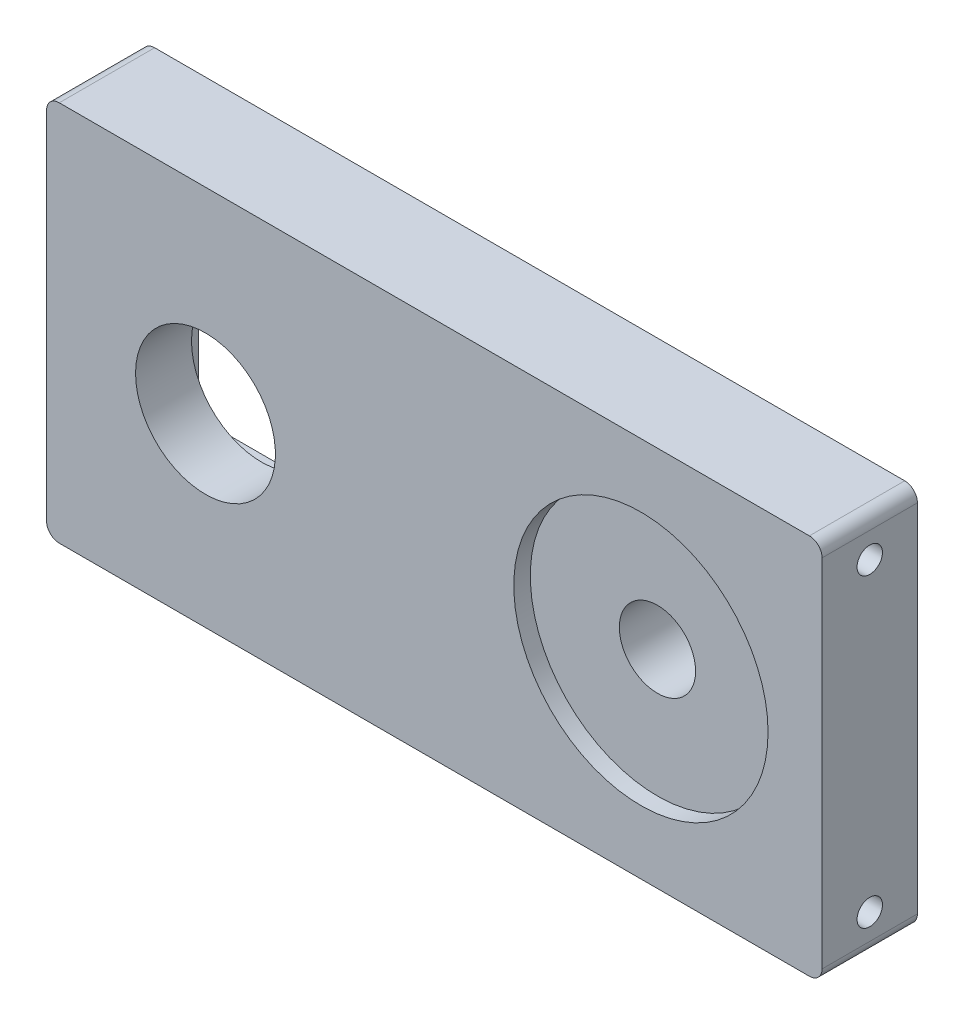
ISO-10303-21;
HEADER;
FILE_DESCRIPTION(('STEP AP214'),'2;1');
FILE_NAME('part.step','',(''),(''),'','','');
FILE_SCHEMA(('AUTOMOTIVE_DESIGN { 1 0 10303 214 1 1 1 1 }'));
ENDSEC;
DATA;
#1=APPLICATION_CONTEXT('core data for automotive mechanical design processes');
#2=APPLICATION_PROTOCOL_DEFINITION('international standard','automotive_design',2000,#1);
#3=PRODUCT_CONTEXT('',#1,'mechanical');
#4=PRODUCT('Part','Part','',(#3));
#5=PRODUCT_RELATED_PRODUCT_CATEGORY('part','',(#4));
#6=PRODUCT_DEFINITION_FORMATION('','',#4);
#7=PRODUCT_DEFINITION_CONTEXT('part definition',#1,'design');
#8=PRODUCT_DEFINITION('design','',#6,#7);
#9=PRODUCT_DEFINITION_SHAPE('','',#8);
#10=(LENGTH_UNIT() NAMED_UNIT(*) SI_UNIT(.MILLI.,.METRE.));
#11=(NAMED_UNIT(*) PLANE_ANGLE_UNIT() SI_UNIT($,.RADIAN.));
#12=(NAMED_UNIT(*) SI_UNIT($,.STERADIAN.) SOLID_ANGLE_UNIT());
#13=UNCERTAINTY_MEASURE_WITH_UNIT(LENGTH_MEASURE(1.E-05),#10,'distance_accuracy_value','');
#14=(GEOMETRIC_REPRESENTATION_CONTEXT(3) GLOBAL_UNCERTAINTY_ASSIGNED_CONTEXT((#13)) GLOBAL_UNIT_ASSIGNED_CONTEXT((#10,
#11,#12)) REPRESENTATION_CONTEXT('',''));
#15=CARTESIAN_POINT('',(0.,0.,0.));
#16=DIRECTION('',(0.,0.,1.));
#17=DIRECTION('',(1.,0.,0.));
#18=AXIS2_PLACEMENT_3D('',#15,#16,#17);
#19=CARTESIAN_POINT('',(32.5,0.,-12.45));
#20=DIRECTION('',(0.,0.,1.));
#21=DIRECTION('',(1.,0.,0.));
#22=AXIS2_PLACEMENT_3D('',#19,#20,#21);
#23=CYLINDRICAL_SURFACE('',#22,6.);
#24=CARTESIAN_POINT('',(32.5,0.,-7.5));
#25=DIRECTION('',(0.,0.,-1.));
#26=DIRECTION('',(-1.,0.,0.));
#27=AXIS2_PLACEMENT_3D('',#24,#25,#26);
#28=CIRCLE('',#27,6.);
#29=CARTESIAN_POINT('',(26.5,0.,-7.5));
#30=VERTEX_POINT('',#29);
#31=EDGE_CURVE('E176',#30,#30,#28,.T.);
#32=ORIENTED_EDGE('',*,*,#31,.T.);
#33=EDGE_LOOP('',(#32));
#34=FACE_BOUND('',#33,.T.);
#35=CARTESIAN_POINT('',(32.5,0.,4.9));
#36=DIRECTION('',(0.,0.,1.));
#37=DIRECTION('',(1.,0.,0.));
#38=AXIS2_PLACEMENT_3D('',#35,#36,#37);
#39=CIRCLE('',#38,6.);
#40=CARTESIAN_POINT('',(38.5,0.,4.9));
#41=VERTEX_POINT('',#40);
#42=EDGE_CURVE('E41',#41,#41,#39,.F.);
#43=ORIENTED_EDGE('',*,*,#42,.F.);
#44=EDGE_LOOP('',(#43));
#45=FACE_BOUND('',#44,.T.);
#46=ADVANCED_FACE('F37',(#34,#45),#23,.F.);
#47=CARTESIAN_POINT('',(-36.,-0.850791996043654,27.5));
#48=DIRECTION('',(0.,0.,-1.));
#49=DIRECTION('',(-1.,0.,0.));
#50=AXIS2_PLACEMENT_3D('',#47,#48,#49);
#51=CYLINDRICAL_SURFACE('',#50,11.);
#52=CARTESIAN_POINT('',(-36.,-0.850791996043654,7.5));
#53=DIRECTION('',(0.,0.,-1.));
#54=DIRECTION('',(-1.,0.,0.));
#55=AXIS2_PLACEMENT_3D('',#52,#53,#54);
#56=CIRCLE('',#55,11.);
#57=CARTESIAN_POINT('',(-47.,-0.850791996043654,7.5));
#58=VERTEX_POINT('',#57);
#59=EDGE_CURVE('E178',#58,#58,#56,.T.);
#60=ORIENTED_EDGE('',*,*,#59,.F.);
#61=EDGE_LOOP('',(#60));
#62=FACE_BOUND('',#61,.T.);
#63=CARTESIAN_POINT('',(-36.,-0.850791996043654,-1.3));
#64=DIRECTION('',(0.,0.,-1.));
#65=DIRECTION('',(-1.,0.,0.));
#66=AXIS2_PLACEMENT_3D('',#63,#64,#65);
#67=CIRCLE('',#66,11.);
#68=CARTESIAN_POINT('',(-47.,-0.850791996043654,-1.3));
#69=VERTEX_POINT('',#68);
#70=EDGE_CURVE('E179',#69,#69,#67,.F.);
#71=ORIENTED_EDGE('',*,*,#70,.F.);
#72=EDGE_LOOP('',(#71));
#73=FACE_BOUND('',#72,.T.);
#74=ADVANCED_FACE('F260',(#62,#73),#51,.F.);
#75=CARTESIAN_POINT('',(59.,28.,7.5));
#76=DIRECTION('',(0.,0.,-1.));
#77=DIRECTION('',(-1.,0.,0.));
#78=AXIS2_PLACEMENT_3D('',#75,#76,#77);
#79=CYLINDRICAL_SURFACE('',#78,2.00000000000001);
#80=CARTESIAN_POINT('',(59.,28.,-7.5));
#81=DIRECTION('',(0.,0.,1.));
#82=DIRECTION('',(-1.,0.,0.));
#83=AXIS2_PLACEMENT_3D('',#80,#81,#82);
#84=CIRCLE('',#83,2.00000000000001);
#85=CARTESIAN_POINT('',(61.,28.,-7.5));
#86=VERTEX_POINT('',#85);
#87=CARTESIAN_POINT('',(59.,30.,-7.5));
#88=VERTEX_POINT('',#87);
#89=EDGE_CURVE('E148',#86,#88,#84,.T.);
#90=ORIENTED_EDGE('',*,*,#89,.T.);
#91=DIRECTION('',(0.,0.,-1.));
#92=VECTOR('',#91,1.);
#93=CARTESIAN_POINT('',(59.,30.,7.5));
#94=LINE('',#93,#92);
#95=CARTESIAN_POINT('',(59.,30.,7.5));
#96=VERTEX_POINT('',#95);
#97=EDGE_CURVE('E11',#96,#88,#94,.T.);
#98=ORIENTED_EDGE('',*,*,#97,.F.);
#99=CARTESIAN_POINT('',(59.,28.,7.5));
#100=DIRECTION('',(0.,0.,1.));
#101=DIRECTION('',(-1.,0.,0.));
#102=AXIS2_PLACEMENT_3D('',#99,#100,#101);
#103=CIRCLE('',#102,2.00000000000001);
#104=CARTESIAN_POINT('',(61.,28.,7.5));
#105=VERTEX_POINT('',#104);
#106=EDGE_CURVE('E164',#105,#96,#103,.T.);
#107=ORIENTED_EDGE('',*,*,#106,.F.);
#108=DIRECTION('',(0.,0.,-1.));
#109=VECTOR('',#108,1.);
#110=CARTESIAN_POINT('',(61.,28.,7.5));
#111=LINE('',#110,#109);
#112=EDGE_CURVE('E144',#105,#86,#111,.T.);
#113=ORIENTED_EDGE('',*,*,#112,.T.);
#114=EDGE_LOOP('',(#90,#98,#107,#113));
#115=FACE_BOUND('',#114,.T.);
#116=ADVANCED_FACE('F39',(#115),#79,.T.);
#117=CARTESIAN_POINT('',(-59.,30.,7.5));
#118=DIRECTION('',(0.,-1.,0.));
#119=DIRECTION('',(0.,0.,-1.));
#120=AXIS2_PLACEMENT_3D('',#117,#118,#119);
#121=PLANE('',#120);
#122=DIRECTION('',(-1.,0.,0.));
#123=VECTOR('',#122,1.);
#124=CARTESIAN_POINT('',(-59.,30.,-7.5));
#125=LINE('',#124,#123);
#126=CARTESIAN_POINT('',(-59.,30.,-7.5));
#127=VERTEX_POINT('',#126);
#128=EDGE_CURVE('E151',#88,#127,#125,.T.);
#129=ORIENTED_EDGE('',*,*,#128,.T.);
#130=DIRECTION('',(0.,0.,-1.));
#131=VECTOR('',#130,1.);
#132=CARTESIAN_POINT('',(-59.,30.,7.5));
#133=LINE('',#132,#131);
#134=CARTESIAN_POINT('',(-59.,30.,7.5));
#135=VERTEX_POINT('',#134);
#136=EDGE_CURVE('E46',#135,#127,#133,.T.);
#137=ORIENTED_EDGE('',*,*,#136,.F.);
#138=DIRECTION('',(-1.,0.,0.));
#139=VECTOR('',#138,1.);
#140=CARTESIAN_POINT('',(-59.,30.,7.5));
#141=LINE('',#140,#139);
#142=EDGE_CURVE('E104',#96,#135,#141,.T.);
#143=ORIENTED_EDGE('',*,*,#142,.F.);
#144=ORIENTED_EDGE('',*,*,#97,.T.);
#145=EDGE_LOOP('',(#129,#137,#143,#144));
#146=FACE_BOUND('',#145,.T.);
#147=ADVANCED_FACE('F248',(#146),#121,.F.);
#148=CARTESIAN_POINT('',(-59.,28.,7.5));
#149=DIRECTION('',(0.,0.,-1.));
#150=DIRECTION('',(-1.,0.,0.));
#151=AXIS2_PLACEMENT_3D('',#148,#149,#150);
#152=CYLINDRICAL_SURFACE('',#151,2.);
#153=CARTESIAN_POINT('',(-59.,28.,-7.5));
#154=DIRECTION('',(0.,0.,1.));
#155=DIRECTION('',(1.,0.,0.));
#156=AXIS2_PLACEMENT_3D('',#153,#154,#155);
#157=CIRCLE('',#156,2.);
#158=CARTESIAN_POINT('',(-61.,28.,-7.5));
#159=VERTEX_POINT('',#158);
#160=EDGE_CURVE('E154',#127,#159,#157,.T.);
#161=ORIENTED_EDGE('',*,*,#160,.T.);
#162=DIRECTION('',(0.,0.,-1.));
#163=VECTOR('',#162,1.);
#164=CARTESIAN_POINT('',(-61.,28.,7.5));
#165=LINE('',#164,#163);
#166=CARTESIAN_POINT('',(-61.,28.,7.5));
#167=VERTEX_POINT('',#166);
#168=EDGE_CURVE('E171',#167,#159,#165,.T.);
#169=ORIENTED_EDGE('',*,*,#168,.F.);
#170=CARTESIAN_POINT('',(-59.,28.,7.5));
#171=DIRECTION('',(0.,0.,1.));
#172=DIRECTION('',(1.,0.,0.));
#173=AXIS2_PLACEMENT_3D('',#170,#171,#172);
#174=CIRCLE('',#173,2.);
#175=EDGE_CURVE('E228',#135,#167,#174,.T.);
#176=ORIENTED_EDGE('',*,*,#175,.F.);
#177=ORIENTED_EDGE('',*,*,#136,.T.);
#178=EDGE_LOOP('',(#161,#169,#176,#177));
#179=FACE_BOUND('',#178,.T.);
#180=ADVANCED_FACE('F251',(#179),#152,.T.);
#181=CARTESIAN_POINT('',(-61.,28.,7.5));
#182=DIRECTION('',(1.,0.,0.));
#183=DIRECTION('',(0.,1.,0.));
#184=AXIS2_PLACEMENT_3D('',#181,#182,#183);
#185=PLANE('',#184);
#186=DIRECTION('',(0.,-1.,0.));
#187=VECTOR('',#186,1.);
#188=CARTESIAN_POINT('',(-61.,28.,-7.5));
#189=LINE('',#188,#187);
#190=CARTESIAN_POINT('',(-61.,-28.,-7.5));
#191=VERTEX_POINT('',#190);
#192=EDGE_CURVE('E156',#159,#191,#189,.T.);
#193=ORIENTED_EDGE('',*,*,#192,.T.);
#194=DIRECTION('',(0.,0.,-1.));
#195=VECTOR('',#194,1.);
#196=CARTESIAN_POINT('',(-61.,-28.,7.5));
#197=LINE('',#196,#195);
#198=CARTESIAN_POINT('',(-61.,-28.,7.5));
#199=VERTEX_POINT('',#198);
#200=EDGE_CURVE('E168',#199,#191,#197,.T.);
#201=ORIENTED_EDGE('',*,*,#200,.F.);
#202=DIRECTION('',(0.,-1.,0.));
#203=VECTOR('',#202,1.);
#204=CARTESIAN_POINT('',(-61.,28.,7.5));
#205=LINE('',#204,#203);
#206=EDGE_CURVE('E230',#167,#199,#205,.T.);
#207=ORIENTED_EDGE('',*,*,#206,.F.);
#208=ORIENTED_EDGE('',*,*,#168,.T.);
#209=EDGE_LOOP('',(#193,#201,#207,#208));
#210=FACE_BOUND('',#209,.T.);
#211=ADVANCED_FACE('F236',(#210),#185,.F.);
#212=CARTESIAN_POINT('',(-59.,-28.,7.5));
#213=DIRECTION('',(0.,0.,-1.));
#214=DIRECTION('',(-1.,0.,0.));
#215=AXIS2_PLACEMENT_3D('',#212,#213,#214);
#216=CYLINDRICAL_SURFACE('',#215,2.);
#217=CARTESIAN_POINT('',(-59.,-28.,-7.5));
#218=DIRECTION('',(0.,0.,1.));
#219=DIRECTION('',(1.,0.,0.));
#220=AXIS2_PLACEMENT_3D('',#217,#218,#219);
#221=CIRCLE('',#220,2.);
#222=CARTESIAN_POINT('',(-59.,-30.,-7.5));
#223=VERTEX_POINT('',#222);
#224=EDGE_CURVE('E158',#191,#223,#221,.T.);
#225=ORIENTED_EDGE('',*,*,#224,.T.);
#226=DIRECTION('',(0.,0.,-1.));
#227=VECTOR('',#226,1.);
#228=CARTESIAN_POINT('',(-59.,-30.,7.5));
#229=LINE('',#228,#227);
#230=CARTESIAN_POINT('',(-59.,-30.,7.5));
#231=VERTEX_POINT('',#230);
#232=EDGE_CURVE('E139',#231,#223,#229,.T.);
#233=ORIENTED_EDGE('',*,*,#232,.F.);
#234=CARTESIAN_POINT('',(-59.,-28.,7.5));
#235=DIRECTION('',(0.,0.,1.));
#236=DIRECTION('',(1.,0.,0.));
#237=AXIS2_PLACEMENT_3D('',#234,#235,#236);
#238=CIRCLE('',#237,2.);
#239=EDGE_CURVE('E127',#199,#231,#238,.T.);
#240=ORIENTED_EDGE('',*,*,#239,.F.);
#241=ORIENTED_EDGE('',*,*,#200,.T.);
#242=EDGE_LOOP('',(#225,#233,#240,#241));
#243=FACE_BOUND('',#242,.T.);
#244=ADVANCED_FACE('F240',(#243),#216,.T.);
#245=CARTESIAN_POINT('',(-59.,-30.,7.5));
#246=DIRECTION('',(0.,1.,0.));
#247=DIRECTION('',(0.,0.,1.));
#248=AXIS2_PLACEMENT_3D('',#245,#246,#247);
#249=PLANE('',#248);
#250=DIRECTION('',(1.,0.,0.));
#251=VECTOR('',#250,1.);
#252=CARTESIAN_POINT('',(-59.,-30.,-7.5));
#253=LINE('',#252,#251);
#254=CARTESIAN_POINT('',(59.,-30.,-7.5));
#255=VERTEX_POINT('',#254);
#256=EDGE_CURVE('E136',#223,#255,#253,.T.);
#257=ORIENTED_EDGE('',*,*,#256,.T.);
#258=DIRECTION('',(0.,0.,-1.));
#259=VECTOR('',#258,1.);
#260=CARTESIAN_POINT('',(59.,-30.,7.5));
#261=LINE('',#260,#259);
#262=CARTESIAN_POINT('',(59.,-30.,7.5));
#263=VERTEX_POINT('',#262);
#264=EDGE_CURVE('E133',#263,#255,#261,.T.);
#265=ORIENTED_EDGE('',*,*,#264,.F.);
#266=DIRECTION('',(1.,0.,0.));
#267=VECTOR('',#266,1.);
#268=CARTESIAN_POINT('',(-59.,-30.,7.5));
#269=LINE('',#268,#267);
#270=EDGE_CURVE('E120',#231,#263,#269,.T.);
#271=ORIENTED_EDGE('',*,*,#270,.F.);
#272=ORIENTED_EDGE('',*,*,#232,.T.);
#273=EDGE_LOOP('',(#257,#265,#271,#272));
#274=FACE_BOUND('',#273,.T.);
#275=ADVANCED_FACE('F134',(#274),#249,.F.);
#276=CARTESIAN_POINT('',(59.,-28.,7.5));
#277=DIRECTION('',(0.,0.,-1.));
#278=DIRECTION('',(-1.,0.,0.));
#279=AXIS2_PLACEMENT_3D('',#276,#277,#278);
#280=CYLINDRICAL_SURFACE('',#279,2.00000000000001);
#281=CARTESIAN_POINT('',(59.,-28.,-7.5));
#282=DIRECTION('',(0.,0.,1.));
#283=DIRECTION('',(1.,0.,0.));
#284=AXIS2_PLACEMENT_3D('',#281,#282,#283);
#285=CIRCLE('',#284,2.00000000000001);
#286=CARTESIAN_POINT('',(61.,-28.,-7.5));
#287=VERTEX_POINT('',#286);
#288=EDGE_CURVE('E161',#255,#287,#285,.T.);
#289=ORIENTED_EDGE('',*,*,#288,.T.);
#290=DIRECTION('',(0.,0.,-1.));
#291=VECTOR('',#290,1.);
#292=CARTESIAN_POINT('',(61.,-28.,7.5));
#293=LINE('',#292,#291);
#294=CARTESIAN_POINT('',(61.,-28.,7.5));
#295=VERTEX_POINT('',#294);
#296=EDGE_CURVE('E140',#295,#287,#293,.T.);
#297=ORIENTED_EDGE('',*,*,#296,.F.);
#298=CARTESIAN_POINT('',(59.,-28.,7.5));
#299=DIRECTION('',(0.,0.,1.));
#300=DIRECTION('',(1.,0.,0.));
#301=AXIS2_PLACEMENT_3D('',#298,#299,#300);
#302=CIRCLE('',#301,2.00000000000001);
#303=EDGE_CURVE('E124',#263,#295,#302,.T.);
#304=ORIENTED_EDGE('',*,*,#303,.F.);
#305=ORIENTED_EDGE('',*,*,#264,.T.);
#306=EDGE_LOOP('',(#289,#297,#304,#305));
#307=FACE_BOUND('',#306,.T.);
#308=ADVANCED_FACE('F142',(#307),#280,.T.);
#309=CARTESIAN_POINT('',(61.,28.,7.5));
#310=DIRECTION('',(-1.,0.,0.));
#311=DIRECTION('',(0.,0.,1.));
#312=AXIS2_PLACEMENT_3D('',#309,#310,#311);
#313=PLANE('',#312);
#314=CARTESIAN_POINT('',(61.,24.,0.));
#315=DIRECTION('',(1.,0.,0.));
#316=DIRECTION('',(0.,1.,0.));
#317=AXIS2_PLACEMENT_3D('',#314,#315,#316);
#318=CIRCLE('',#317,2.);
#319=CARTESIAN_POINT('',(61.,26.,0.));
#320=VERTEX_POINT('',#319);
#321=EDGE_CURVE('E218',#320,#320,#318,.T.);
#322=ORIENTED_EDGE('',*,*,#321,.F.);
#323=EDGE_LOOP('',(#322));
#324=FACE_BOUND('',#323,.T.);
#325=CARTESIAN_POINT('',(61.,-24.,0.));
#326=DIRECTION('',(1.,0.,0.));
#327=DIRECTION('',(0.,-1.,0.));
#328=AXIS2_PLACEMENT_3D('',#325,#326,#327);
#329=CIRCLE('',#328,2.);
#330=CARTESIAN_POINT('',(61.,-26.,0.));
#331=VERTEX_POINT('',#330);
#332=EDGE_CURVE('E215',#331,#331,#329,.T.);
#333=ORIENTED_EDGE('',*,*,#332,.F.);
#334=EDGE_LOOP('',(#333));
#335=FACE_BOUND('',#334,.T.);
#336=DIRECTION('',(0.,1.,0.));
#337=VECTOR('',#336,1.);
#338=CARTESIAN_POINT('',(61.,28.,-7.5));
#339=LINE('',#338,#337);
#340=EDGE_CURVE('E96',#287,#86,#339,.T.);
#341=ORIENTED_EDGE('',*,*,#340,.T.);
#342=ORIENTED_EDGE('',*,*,#112,.F.);
#343=DIRECTION('',(0.,1.,0.));
#344=VECTOR('',#343,1.);
#345=CARTESIAN_POINT('',(61.,28.,7.5));
#346=LINE('',#345,#344);
#347=EDGE_CURVE('E63',#295,#105,#346,.T.);
#348=ORIENTED_EDGE('',*,*,#347,.F.);
#349=ORIENTED_EDGE('',*,*,#296,.T.);
#350=EDGE_LOOP('',(#341,#342,#348,#349));
#351=FACE_BOUND('',#350,.T.);
#352=ADVANCED_FACE('F244',(#324,#335,#351),#313,.F.);
#353=CARTESIAN_POINT('',(59.,28.,7.5));
#354=DIRECTION('',(0.,0.,-1.));
#355=DIRECTION('',(-1.,0.,0.));
#356=AXIS2_PLACEMENT_3D('',#353,#354,#355);
#357=PLANE('',#356);
#358=CARTESIAN_POINT('',(32.5,0.,7.5));
#359=DIRECTION('',(0.,0.,1.));
#360=DIRECTION('',(1.,0.,0.));
#361=AXIS2_PLACEMENT_3D('',#358,#359,#360);
#362=CIRCLE('',#361,20.);
#363=CARTESIAN_POINT('',(52.5,0.,7.5));
#364=VERTEX_POINT('',#363);
#365=EDGE_CURVE('E508',#364,#364,#362,.T.);
#366=ORIENTED_EDGE('',*,*,#365,.F.);
#367=EDGE_LOOP('',(#366));
#368=FACE_BOUND('',#367,.T.);
#369=ORIENTED_EDGE('',*,*,#59,.T.);
#370=EDGE_LOOP('',(#369));
#371=FACE_BOUND('',#370,.T.);
#372=ORIENTED_EDGE('',*,*,#106,.T.);
#373=ORIENTED_EDGE('',*,*,#142,.T.);
#374=ORIENTED_EDGE('',*,*,#175,.T.);
#375=ORIENTED_EDGE('',*,*,#206,.T.);
#376=ORIENTED_EDGE('',*,*,#239,.T.);
#377=ORIENTED_EDGE('',*,*,#270,.T.);
#378=ORIENTED_EDGE('',*,*,#303,.T.);
#379=ORIENTED_EDGE('',*,*,#347,.T.);
#380=EDGE_LOOP('',(#372,#373,#374,#375,#376,#377,#378,#379));
#381=FACE_BOUND('',#380,.T.);
#382=ADVANCED_FACE('F122',(#368,#371,#381),#357,.F.);
#383=CARTESIAN_POINT('',(59.,28.,-7.5));
#384=DIRECTION('',(0.,0.,-1.));
#385=DIRECTION('',(-1.,0.,0.));
#386=AXIS2_PLACEMENT_3D('',#383,#384,#385);
#387=PLANE('',#386);
#388=DIRECTION('',(0.,1.,0.));
#389=VECTOR('',#388,1.);
#390=CARTESIAN_POINT('',(-52.1,12.2492080039563,-7.5));
#391=LINE('',#390,#389);
#392=CARTESIAN_POINT('',(-52.1,-13.9507919960437,-7.5));
#393=VERTEX_POINT('',#392);
#394=CARTESIAN_POINT('',(-52.1,12.2492080039563,-7.5));
#395=VERTEX_POINT('',#394);
#396=EDGE_CURVE('E54',#393,#395,#391,.T.);
#397=ORIENTED_EDGE('',*,*,#396,.F.);
#398=DIRECTION('',(-0.707106781186549,0.707106781186546,0.));
#399=VECTOR('',#398,1.);
#400=CARTESIAN_POINT('',(-52.1,-13.9507919960437,-7.5));
#401=LINE('',#400,#399);
#402=CARTESIAN_POINT('',(-49.1,-16.9507919960437,-7.5));
#403=VERTEX_POINT('',#402);
#404=EDGE_CURVE('E193',#403,#393,#401,.T.);
#405=ORIENTED_EDGE('',*,*,#404,.F.);
#406=DIRECTION('',(-1.,0.,0.));
#407=VECTOR('',#406,1.);
#408=CARTESIAN_POINT('',(-22.9,-16.9507919960437,-7.5));
#409=LINE('',#408,#407);
#410=CARTESIAN_POINT('',(-22.9,-16.9507919960437,-7.5));
#411=VERTEX_POINT('',#410);
#412=EDGE_CURVE('E550',#411,#403,#409,.T.);
#413=ORIENTED_EDGE('',*,*,#412,.F.);
#414=DIRECTION('',(-0.707106781186548,-0.707106781186548,0.));
#415=VECTOR('',#414,1.);
#416=CARTESIAN_POINT('',(-19.9,-13.9507919960437,-7.5));
#417=LINE('',#416,#415);
#418=CARTESIAN_POINT('',(-19.9,-13.9507919960437,-7.5));
#419=VERTEX_POINT('',#418);
#420=EDGE_CURVE('E548',#419,#411,#417,.T.);
#421=ORIENTED_EDGE('',*,*,#420,.F.);
#422=DIRECTION('',(0.,-1.,0.));
#423=VECTOR('',#422,1.);
#424=CARTESIAN_POINT('',(-19.9,12.2492080039563,-7.5));
#425=LINE('',#424,#423);
#426=CARTESIAN_POINT('',(-19.9,12.2492080039563,-7.5));
#427=VERTEX_POINT('',#426);
#428=EDGE_CURVE('E545',#427,#419,#425,.T.);
#429=ORIENTED_EDGE('',*,*,#428,.F.);
#430=DIRECTION('',(0.707106781186547,-0.707106781186548,0.));
#431=VECTOR('',#430,1.);
#432=CARTESIAN_POINT('',(-22.9,15.2492080039563,-7.5));
#433=LINE('',#432,#431);
#434=CARTESIAN_POINT('',(-22.9,15.2492080039563,-7.5));
#435=VERTEX_POINT('',#434);
#436=EDGE_CURVE('E542',#435,#427,#433,.T.);
#437=ORIENTED_EDGE('',*,*,#436,.F.);
#438=DIRECTION('',(1.,0.,0.));
#439=VECTOR('',#438,1.);
#440=CARTESIAN_POINT('',(-22.9,15.2492080039563,-7.5));
#441=LINE('',#440,#439);
#442=CARTESIAN_POINT('',(-49.1,15.2492080039563,-7.5));
#443=VERTEX_POINT('',#442);
#444=EDGE_CURVE('E539',#443,#435,#441,.T.);
#445=ORIENTED_EDGE('',*,*,#444,.F.);
#446=DIRECTION('',(0.707106781186547,0.707106781186548,0.));
#447=VECTOR('',#446,1.);
#448=CARTESIAN_POINT('',(-49.1,15.2492080039563,-7.5));
#449=LINE('',#448,#447);
#450=EDGE_CURVE('E536',#395,#443,#449,.T.);
#451=ORIENTED_EDGE('',*,*,#450,.F.);
#452=EDGE_LOOP('',(#397,#405,#413,#421,#429,#437,#445,#451));
#453=FACE_BOUND('',#452,.T.);
#454=ORIENTED_EDGE('',*,*,#31,.F.);
#455=EDGE_LOOP('',(#454));
#456=FACE_BOUND('',#455,.T.);
#457=ORIENTED_EDGE('',*,*,#89,.F.);
#458=ORIENTED_EDGE('',*,*,#340,.F.);
#459=ORIENTED_EDGE('',*,*,#288,.F.);
#460=ORIENTED_EDGE('',*,*,#256,.F.);
#461=ORIENTED_EDGE('',*,*,#224,.F.);
#462=ORIENTED_EDGE('',*,*,#192,.F.);
#463=ORIENTED_EDGE('',*,*,#160,.F.);
#464=ORIENTED_EDGE('',*,*,#128,.F.);
#465=EDGE_LOOP('',(#457,#458,#459,#460,#461,#462,#463,#464));
#466=FACE_BOUND('',#465,.T.);
#467=ADVANCED_FACE('F243',(#453,#456,#466),#387,.T.);
#468=CARTESIAN_POINT('',(46.,-24.,0.));
#469=DIRECTION('',(1.,0.,0.));
#470=DIRECTION('',(0.,1.,0.));
#471=AXIS2_PLACEMENT_3D('',#468,#469,#470);
#472=CYLINDRICAL_SURFACE('',#471,2.);
#473=CARTESIAN_POINT('',(46.,-24.,0.));
#474=DIRECTION('',(1.,0.,0.));
#475=DIRECTION('',(0.,-1.,0.));
#476=AXIS2_PLACEMENT_3D('',#473,#474,#475);
#477=CIRCLE('',#476,2.);
#478=CARTESIAN_POINT('',(46.,-26.,0.));
#479=VERTEX_POINT('',#478);
#480=EDGE_CURVE('E221',#479,#479,#477,.T.);
#481=ORIENTED_EDGE('',*,*,#480,.F.);
#482=EDGE_LOOP('',(#481));
#483=FACE_BOUND('',#482,.T.);
#484=ORIENTED_EDGE('',*,*,#332,.T.);
#485=EDGE_LOOP('',(#484));
#486=FACE_BOUND('',#485,.T.);
#487=ADVANCED_FACE('F285',(#483,#486),#472,.F.);
#488=CARTESIAN_POINT('',(46.,-24.,0.));
#489=DIRECTION('',(-1.,0.,0.));
#490=DIRECTION('',(0.,-1.,0.));
#491=AXIS2_PLACEMENT_3D('',#488,#489,#490);
#492=PLANE('',#491);
#493=ORIENTED_EDGE('',*,*,#480,.T.);
#494=EDGE_LOOP('',(#493));
#495=FACE_BOUND('',#494,.T.);
#496=ADVANCED_FACE('F281',(#495),#492,.F.);
#497=CARTESIAN_POINT('',(46.,24.,0.));
#498=DIRECTION('',(1.,0.,0.));
#499=DIRECTION('',(0.,1.,0.));
#500=AXIS2_PLACEMENT_3D('',#497,#498,#499);
#501=CYLINDRICAL_SURFACE('',#500,2.);
#502=CARTESIAN_POINT('',(46.,24.,0.));
#503=DIRECTION('',(1.,0.,0.));
#504=DIRECTION('',(0.,1.,0.));
#505=AXIS2_PLACEMENT_3D('',#502,#503,#504);
#506=CIRCLE('',#505,2.);
#507=CARTESIAN_POINT('',(46.,26.,0.));
#508=VERTEX_POINT('',#507);
#509=EDGE_CURVE('E152',#508,#508,#506,.T.);
#510=ORIENTED_EDGE('',*,*,#509,.F.);
#511=EDGE_LOOP('',(#510));
#512=FACE_BOUND('',#511,.T.);
#513=ORIENTED_EDGE('',*,*,#321,.T.);
#514=EDGE_LOOP('',(#513));
#515=FACE_BOUND('',#514,.T.);
#516=ADVANCED_FACE('F277',(#512,#515),#501,.F.);
#517=CARTESIAN_POINT('',(46.,24.,0.));
#518=DIRECTION('',(1.,0.,0.));
#519=DIRECTION('',(0.,1.,0.));
#520=AXIS2_PLACEMENT_3D('',#517,#518,#519);
#521=PLANE('',#520);
#522=ORIENTED_EDGE('',*,*,#509,.T.);
#523=EDGE_LOOP('',(#522));
#524=FACE_BOUND('',#523,.T.);
#525=ADVANCED_FACE('F273',(#524),#521,.T.);
#526=CARTESIAN_POINT('',(0.,0.,-1.3));
#527=DIRECTION('',(0.,0.,-1.));
#528=DIRECTION('',(-1.,0.,0.));
#529=AXIS2_PLACEMENT_3D('',#526,#527,#528);
#530=PLANE('',#529);
#531=DIRECTION('',(0.,1.,0.));
#532=VECTOR('',#531,1.);
#533=CARTESIAN_POINT('',(-52.1,12.2492080039563,-1.3));
#534=LINE('',#533,#532);
#535=CARTESIAN_POINT('',(-52.1,-13.9507919960437,-1.3));
#536=VERTEX_POINT('',#535);
#537=CARTESIAN_POINT('',(-52.1,12.2492080039563,-1.3));
#538=VERTEX_POINT('',#537);
#539=EDGE_CURVE('E512',#536,#538,#534,.T.);
#540=ORIENTED_EDGE('',*,*,#539,.T.);
#541=DIRECTION('',(0.707106781186547,0.707106781186548,0.));
#542=VECTOR('',#541,1.);
#543=CARTESIAN_POINT('',(-49.1,15.2492080039563,-1.3));
#544=LINE('',#543,#542);
#545=CARTESIAN_POINT('',(-49.1,15.2492080039563,-1.3));
#546=VERTEX_POINT('',#545);
#547=EDGE_CURVE('E515',#538,#546,#544,.T.);
#548=ORIENTED_EDGE('',*,*,#547,.T.);
#549=DIRECTION('',(1.,0.,0.));
#550=VECTOR('',#549,1.);
#551=CARTESIAN_POINT('',(-22.9,15.2492080039563,-1.3));
#552=LINE('',#551,#550);
#553=CARTESIAN_POINT('',(-22.9,15.2492080039563,-1.3));
#554=VERTEX_POINT('',#553);
#555=EDGE_CURVE('E518',#546,#554,#552,.T.);
#556=ORIENTED_EDGE('',*,*,#555,.T.);
#557=DIRECTION('',(0.707106781186547,-0.707106781186548,0.));
#558=VECTOR('',#557,1.);
#559=CARTESIAN_POINT('',(-22.9,15.2492080039563,-1.3));
#560=LINE('',#559,#558);
#561=CARTESIAN_POINT('',(-19.9,12.2492080039563,-1.3));
#562=VERTEX_POINT('',#561);
#563=EDGE_CURVE('E521',#554,#562,#560,.T.);
#564=ORIENTED_EDGE('',*,*,#563,.T.);
#565=DIRECTION('',(0.,-1.,0.));
#566=VECTOR('',#565,1.);
#567=CARTESIAN_POINT('',(-19.9,12.2492080039563,-1.3));
#568=LINE('',#567,#566);
#569=CARTESIAN_POINT('',(-19.9,-13.9507919960437,-1.3));
#570=VERTEX_POINT('',#569);
#571=EDGE_CURVE('E524',#562,#570,#568,.T.);
#572=ORIENTED_EDGE('',*,*,#571,.T.);
#573=DIRECTION('',(-0.707106781186548,-0.707106781186548,0.));
#574=VECTOR('',#573,1.);
#575=CARTESIAN_POINT('',(-19.9,-13.9507919960437,-1.3));
#576=LINE('',#575,#574);
#577=CARTESIAN_POINT('',(-22.9,-16.9507919960437,-1.3));
#578=VERTEX_POINT('',#577);
#579=EDGE_CURVE('E527',#570,#578,#576,.T.);
#580=ORIENTED_EDGE('',*,*,#579,.T.);
#581=DIRECTION('',(-1.,0.,0.));
#582=VECTOR('',#581,1.);
#583=CARTESIAN_POINT('',(-22.9,-16.9507919960437,-1.3));
#584=LINE('',#583,#582);
#585=CARTESIAN_POINT('',(-49.1,-16.9507919960437,-1.3));
#586=VERTEX_POINT('',#585);
#587=EDGE_CURVE('E530',#578,#586,#584,.T.);
#588=ORIENTED_EDGE('',*,*,#587,.T.);
#589=DIRECTION('',(-0.707106781186549,0.707106781186546,0.));
#590=VECTOR('',#589,1.);
#591=CARTESIAN_POINT('',(-52.1,-13.9507919960437,-1.3));
#592=LINE('',#591,#590);
#593=EDGE_CURVE('E212',#586,#536,#592,.T.);
#594=ORIENTED_EDGE('',*,*,#593,.T.);
#595=EDGE_LOOP('',(#540,#548,#556,#564,#572,#580,#588,#594));
#596=FACE_BOUND('',#595,.T.);
#597=ORIENTED_EDGE('',*,*,#70,.T.);
#598=EDGE_LOOP('',(#597));
#599=FACE_BOUND('',#598,.T.);
#600=ADVANCED_FACE('F276',(#596,#599),#530,.T.);
#601=CARTESIAN_POINT('',(-52.1,12.2492080039563,-1.3));
#602=DIRECTION('',(-1.,0.,0.));
#603=DIRECTION('',(0.,-1.,0.));
#604=AXIS2_PLACEMENT_3D('',#601,#602,#603);
#605=PLANE('',#604);
#606=ORIENTED_EDGE('',*,*,#396,.T.);
#607=DIRECTION('',(0.,0.,-1.));
#608=VECTOR('',#607,1.);
#609=CARTESIAN_POINT('',(-52.1,12.2492080039563,-1.3));
#610=LINE('',#609,#608);
#611=EDGE_CURVE('E210',#538,#395,#610,.T.);
#612=ORIENTED_EDGE('',*,*,#611,.F.);
#613=ORIENTED_EDGE('',*,*,#539,.F.);
#614=DIRECTION('',(0.,0.,-1.));
#615=VECTOR('',#614,1.);
#616=CARTESIAN_POINT('',(-52.1,-13.9507919960437,-1.3));
#617=LINE('',#616,#615);
#618=EDGE_CURVE('E181',#536,#393,#617,.T.);
#619=ORIENTED_EDGE('',*,*,#618,.T.);
#620=EDGE_LOOP('',(#606,#612,#613,#619));
#621=FACE_BOUND('',#620,.T.);
#622=ADVANCED_FACE('F270',(#621),#605,.F.);
#623=CARTESIAN_POINT('',(-52.1,-13.9507919960437,-1.3));
#624=DIRECTION('',(-0.707106781186546,-0.707106781186549,0.));
#625=DIRECTION('',(0.707106781186549,-0.707106781186546,0.));
#626=AXIS2_PLACEMENT_3D('',#623,#624,#625);
#627=PLANE('',#626);
#628=ORIENTED_EDGE('',*,*,#404,.T.);
#629=ORIENTED_EDGE('',*,*,#618,.F.);
#630=ORIENTED_EDGE('',*,*,#593,.F.);
#631=DIRECTION('',(0.,0.,-1.));
#632=VECTOR('',#631,1.);
#633=CARTESIAN_POINT('',(-49.1,-16.9507919960437,-1.3));
#634=LINE('',#633,#632);
#635=EDGE_CURVE('E184',#586,#403,#634,.T.);
#636=ORIENTED_EDGE('',*,*,#635,.T.);
#637=EDGE_LOOP('',(#628,#629,#630,#636));
#638=FACE_BOUND('',#637,.T.);
#639=ADVANCED_FACE('F359',(#638),#627,.F.);
#640=CARTESIAN_POINT('',(-22.9,-16.9507919960437,-1.3));
#641=DIRECTION('',(0.,-1.,0.));
#642=DIRECTION('',(0.,0.,-1.));
#643=AXIS2_PLACEMENT_3D('',#640,#641,#642);
#644=PLANE('',#643);
#645=ORIENTED_EDGE('',*,*,#412,.T.);
#646=ORIENTED_EDGE('',*,*,#635,.F.);
#647=ORIENTED_EDGE('',*,*,#587,.F.);
#648=DIRECTION('',(0.,0.,-1.));
#649=VECTOR('',#648,1.);
#650=CARTESIAN_POINT('',(-22.9,-16.9507919960437,-1.3));
#651=LINE('',#650,#649);
#652=EDGE_CURVE('E190',#578,#411,#651,.T.);
#653=ORIENTED_EDGE('',*,*,#652,.T.);
#654=EDGE_LOOP('',(#645,#646,#647,#653));
#655=FACE_BOUND('',#654,.T.);
#656=ADVANCED_FACE('F365',(#655),#644,.F.);
#657=CARTESIAN_POINT('',(-19.9,-13.9507919960437,-1.3));
#658=DIRECTION('',(0.707106781186547,-0.707106781186547,0.));
#659=DIRECTION('',(0.707106781186548,0.707106781186548,0.));
#660=AXIS2_PLACEMENT_3D('',#657,#658,#659);
#661=PLANE('',#660);
#662=ORIENTED_EDGE('',*,*,#420,.T.);
#663=ORIENTED_EDGE('',*,*,#652,.F.);
#664=ORIENTED_EDGE('',*,*,#579,.F.);
#665=DIRECTION('',(0.,0.,-1.));
#666=VECTOR('',#665,1.);
#667=CARTESIAN_POINT('',(-19.9,-13.9507919960437,-1.3));
#668=LINE('',#667,#666);
#669=EDGE_CURVE('E198',#570,#419,#668,.T.);
#670=ORIENTED_EDGE('',*,*,#669,.T.);
#671=EDGE_LOOP('',(#662,#663,#664,#670));
#672=FACE_BOUND('',#671,.T.);
#673=ADVANCED_FACE('F373',(#672),#661,.F.);
#674=CARTESIAN_POINT('',(-19.9,12.2492080039563,-1.3));
#675=DIRECTION('',(1.,0.,0.));
#676=DIRECTION('',(0.,1.,0.));
#677=AXIS2_PLACEMENT_3D('',#674,#675,#676);
#678=PLANE('',#677);
#679=ORIENTED_EDGE('',*,*,#428,.T.);
#680=ORIENTED_EDGE('',*,*,#669,.F.);
#681=ORIENTED_EDGE('',*,*,#571,.F.);
#682=DIRECTION('',(0.,0.,-1.));
#683=VECTOR('',#682,1.);
#684=CARTESIAN_POINT('',(-19.9,12.2492080039563,-1.3));
#685=LINE('',#684,#683);
#686=EDGE_CURVE('E201',#562,#427,#685,.T.);
#687=ORIENTED_EDGE('',*,*,#686,.T.);
#688=EDGE_LOOP('',(#679,#680,#681,#687));
#689=FACE_BOUND('',#688,.T.);
#690=ADVANCED_FACE('F381',(#689),#678,.F.);
#691=CARTESIAN_POINT('',(-22.9,15.2492080039563,-1.3));
#692=DIRECTION('',(0.707106781186548,0.707106781186547,0.));
#693=DIRECTION('',(-0.707106781186547,0.707106781186548,0.));
#694=AXIS2_PLACEMENT_3D('',#691,#692,#693);
#695=PLANE('',#694);
#696=ORIENTED_EDGE('',*,*,#436,.T.);
#697=ORIENTED_EDGE('',*,*,#686,.F.);
#698=ORIENTED_EDGE('',*,*,#563,.F.);
#699=DIRECTION('',(0.,0.,-1.));
#700=VECTOR('',#699,1.);
#701=CARTESIAN_POINT('',(-22.9,15.2492080039563,-1.3));
#702=LINE('',#701,#700);
#703=EDGE_CURVE('E204',#554,#435,#702,.T.);
#704=ORIENTED_EDGE('',*,*,#703,.T.);
#705=EDGE_LOOP('',(#696,#697,#698,#704));
#706=FACE_BOUND('',#705,.T.);
#707=ADVANCED_FACE('F389',(#706),#695,.F.);
#708=CARTESIAN_POINT('',(-22.9,15.2492080039563,-1.3));
#709=DIRECTION('',(0.,1.,0.));
#710=DIRECTION('',(0.,0.,1.));
#711=AXIS2_PLACEMENT_3D('',#708,#709,#710);
#712=PLANE('',#711);
#713=ORIENTED_EDGE('',*,*,#444,.T.);
#714=ORIENTED_EDGE('',*,*,#703,.F.);
#715=ORIENTED_EDGE('',*,*,#555,.F.);
#716=DIRECTION('',(0.,0.,-1.));
#717=VECTOR('',#716,1.);
#718=CARTESIAN_POINT('',(-49.1,15.2492080039563,-1.3));
#719=LINE('',#718,#717);
#720=EDGE_CURVE('E207',#546,#443,#719,.T.);
#721=ORIENTED_EDGE('',*,*,#720,.T.);
#722=EDGE_LOOP('',(#713,#714,#715,#721));
#723=FACE_BOUND('',#722,.T.);
#724=ADVANCED_FACE('F397',(#723),#712,.F.);
#725=CARTESIAN_POINT('',(-49.1,15.2492080039563,-1.3));
#726=DIRECTION('',(-0.707106781186548,0.707106781186547,0.));
#727=DIRECTION('',(-0.707106781186547,-0.707106781186548,0.));
#728=AXIS2_PLACEMENT_3D('',#725,#726,#727);
#729=PLANE('',#728);
#730=ORIENTED_EDGE('',*,*,#450,.T.);
#731=ORIENTED_EDGE('',*,*,#720,.F.);
#732=ORIENTED_EDGE('',*,*,#547,.F.);
#733=ORIENTED_EDGE('',*,*,#611,.T.);
#734=EDGE_LOOP('',(#730,#731,#732,#733));
#735=FACE_BOUND('',#734,.T.);
#736=ADVANCED_FACE('F405',(#735),#729,.F.);
#737=CARTESIAN_POINT('',(32.5,0.,4.9));
#738=DIRECTION('',(0.,0.,1.));
#739=DIRECTION('',(1.,0.,0.));
#740=AXIS2_PLACEMENT_3D('',#737,#738,#739);
#741=PLANE('',#740);
#742=CARTESIAN_POINT('',(32.5,0.,4.9));
#743=DIRECTION('',(0.,0.,1.));
#744=DIRECTION('',(1.,0.,0.));
#745=AXIS2_PLACEMENT_3D('',#742,#743,#744);
#746=CIRCLE('',#745,20.);
#747=CARTESIAN_POINT('',(52.5,0.,4.9));
#748=VERTEX_POINT('',#747);
#749=EDGE_CURVE('E505',#748,#748,#746,.T.);
#750=ORIENTED_EDGE('',*,*,#749,.T.);
#751=EDGE_LOOP('',(#750));
#752=FACE_BOUND('',#751,.T.);
#753=ORIENTED_EDGE('',*,*,#42,.T.);
#754=EDGE_LOOP('',(#753));
#755=FACE_BOUND('',#754,.T.);
#756=ADVANCED_FACE('F413',(#752,#755),#741,.T.);
#757=CARTESIAN_POINT('',(32.5,0.,4.9));
#758=DIRECTION('',(0.,0.,1.));
#759=DIRECTION('',(1.,0.,0.));
#760=AXIS2_PLACEMENT_3D('',#757,#758,#759);
#761=CYLINDRICAL_SURFACE('',#760,20.);
#762=ORIENTED_EDGE('',*,*,#749,.F.);
#763=EDGE_LOOP('',(#762));
#764=FACE_BOUND('',#763,.T.);
#765=ORIENTED_EDGE('',*,*,#365,.T.);
#766=EDGE_LOOP('',(#765));
#767=FACE_BOUND('',#766,.T.);
#768=ADVANCED_FACE('F419',(#764,#767),#761,.F.);
#769=CLOSED_SHELL('',(#46,#74,#116,#147,#180,#211,#244,#275,#308,#352,#382,#467,#487,#496,#516,
#525,#600,#622,#639,#656,#673,#690,#707,#724,#736,#756,#768));
#770=MANIFOLD_SOLID_BREP('B2',#769);
#771=ADVANCED_BREP_SHAPE_REPRESENTATION('',(#18,#770),#14);
#772=SHAPE_DEFINITION_REPRESENTATION(#9,#771);
ENDSEC;
END-ISO-10303-21;
